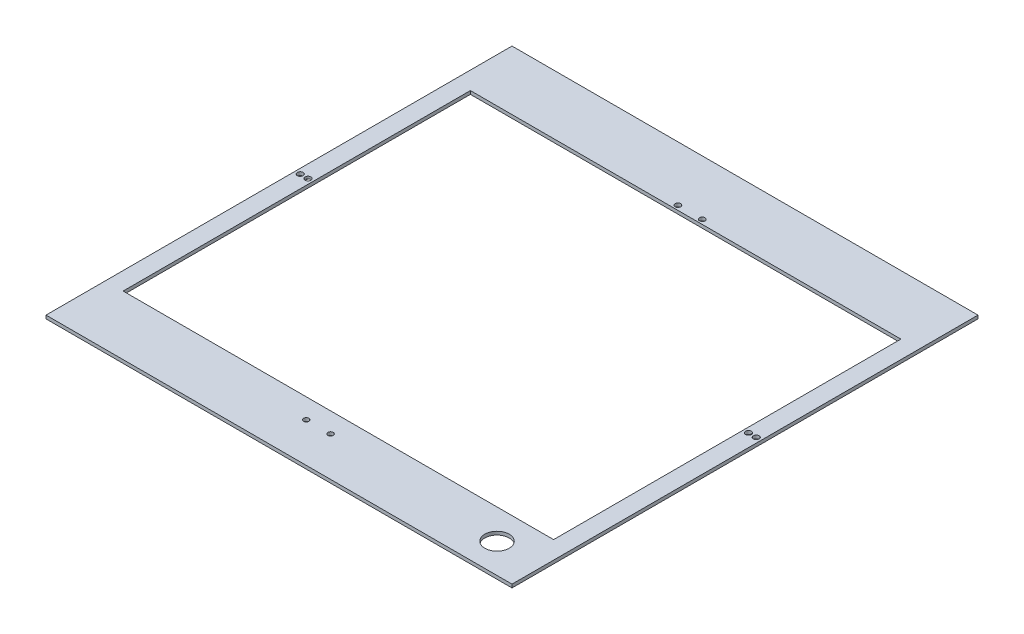
ISO-10303-21;
HEADER;
FILE_DESCRIPTION(('STEP AP214'),'2;1');
FILE_NAME('part.step','',(''),(''),'','','');
FILE_SCHEMA(('AUTOMOTIVE_DESIGN { 1 0 10303 214 1 1 1 1 }'));
ENDSEC;
DATA;
#1=APPLICATION_CONTEXT('core data for automotive mechanical design processes');
#2=APPLICATION_PROTOCOL_DEFINITION('international standard','automotive_design',2000,#1);
#3=PRODUCT_CONTEXT('',#1,'mechanical');
#4=PRODUCT('Part','Part','',(#3));
#5=PRODUCT_RELATED_PRODUCT_CATEGORY('part','',(#4));
#6=PRODUCT_DEFINITION_FORMATION('','',#4);
#7=PRODUCT_DEFINITION_CONTEXT('part definition',#1,'design');
#8=PRODUCT_DEFINITION('design','',#6,#7);
#9=PRODUCT_DEFINITION_SHAPE('','',#8);
#10=(LENGTH_UNIT() NAMED_UNIT(*) SI_UNIT(.MILLI.,.METRE.));
#11=(NAMED_UNIT(*) PLANE_ANGLE_UNIT() SI_UNIT($,.RADIAN.));
#12=(NAMED_UNIT(*) SI_UNIT($,.STERADIAN.) SOLID_ANGLE_UNIT());
#13=UNCERTAINTY_MEASURE_WITH_UNIT(LENGTH_MEASURE(1.E-05),#10,'distance_accuracy_value','');
#14=(GEOMETRIC_REPRESENTATION_CONTEXT(3) GLOBAL_UNCERTAINTY_ASSIGNED_CONTEXT((#13)) GLOBAL_UNIT_ASSIGNED_CONTEXT((#10,
#11,#12)) REPRESENTATION_CONTEXT('',''));
#15=CARTESIAN_POINT('',(0.,0.,0.));
#16=DIRECTION('',(0.,0.,1.));
#17=DIRECTION('',(1.,0.,0.));
#18=AXIS2_PLACEMENT_3D('',#15,#16,#17);
#19=CARTESIAN_POINT('',(0.,0.,0.));
#20=DIRECTION('',(0.,-1.,0.));
#21=DIRECTION('',(0.,0.,-1.));
#22=AXIS2_PLACEMENT_3D('',#19,#20,#21);
#23=PLANE('',#22);
#24=CARTESIAN_POINT('',(-205.5,0.,-14.63));
#25=DIRECTION('',(0.,1.,0.));
#26=DIRECTION('',(0.,0.,1.));
#27=AXIS2_PLACEMENT_3D('',#24,#25,#26);
#28=CIRCLE('',#27,2.59999999999999);
#29=CARTESIAN_POINT('',(-205.5,0.,-12.03));
#30=VERTEX_POINT('',#29);
#31=EDGE_CURVE('E356',#30,#30,#28,.T.);
#32=ORIENTED_EDGE('',*,*,#31,.T.);
#33=EDGE_LOOP('',(#32));
#34=FACE_BOUND('',#33,.T.);
#35=DIRECTION('',(0.,0.,1.));
#36=VECTOR('',#35,1.);
#37=CARTESIAN_POINT('',(-201.25,0.,0.));
#38=LINE('',#37,#36);
#39=CARTESIAN_POINT('',(-201.25,0.,-166.25));
#40=VERTEX_POINT('',#39);
#41=CARTESIAN_POINT('',(-201.25,0.,166.25));
#42=VERTEX_POINT('',#41);
#43=EDGE_CURVE('E313',#40,#42,#38,.T.);
#44=ORIENTED_EDGE('',*,*,#43,.T.);
#45=DIRECTION('',(1.,0.,0.));
#46=VECTOR('',#45,1.);
#47=CARTESIAN_POINT('',(0.,0.,166.25));
#48=LINE('',#47,#46);
#49=CARTESIAN_POINT('',(201.25,0.,166.25));
#50=VERTEX_POINT('',#49);
#51=EDGE_CURVE('E310',#42,#50,#48,.T.);
#52=ORIENTED_EDGE('',*,*,#51,.T.);
#53=DIRECTION('',(0.,0.,-1.));
#54=VECTOR('',#53,1.);
#55=CARTESIAN_POINT('',(201.25,0.,0.));
#56=LINE('',#55,#54);
#57=CARTESIAN_POINT('',(201.25,0.,-166.25));
#58=VERTEX_POINT('',#57);
#59=EDGE_CURVE('E320',#50,#58,#56,.T.);
#60=ORIENTED_EDGE('',*,*,#59,.T.);
#61=DIRECTION('',(-1.,0.,0.));
#62=VECTOR('',#61,1.);
#63=CARTESIAN_POINT('',(0.,0.,-166.25));
#64=LINE('',#63,#62);
#65=EDGE_CURVE('E317',#58,#40,#64,.T.);
#66=ORIENTED_EDGE('',*,*,#65,.T.);
#67=EDGE_LOOP('',(#44,#52,#60,#66));
#68=FACE_BOUND('',#67,.T.);
#69=CARTESIAN_POINT('',(169.75,0.,183.25));
#70=DIRECTION('',(0.,1.,0.));
#71=DIRECTION('',(0.,0.,1.));
#72=AXIS2_PLACEMENT_3D('',#69,#70,#71);
#73=CIRCLE('',#72,10.9999999999999);
#74=CARTESIAN_POINT('',(169.75,0.,194.25));
#75=VERTEX_POINT('',#74);
#76=EDGE_CURVE('E208',#75,#75,#73,.T.);
#77=ORIENTED_EDGE('',*,*,#76,.T.);
#78=EDGE_LOOP('',(#77));
#79=FACE_BOUND('',#78,.T.);
#80=DIRECTION('',(0.,0.,-1.));
#81=VECTOR('',#80,1.);
#82=CARTESIAN_POINT('',(210.,0.,210.));
#83=LINE('',#82,#81);
#84=CARTESIAN_POINT('',(210.,0.,210.));
#85=VERTEX_POINT('',#84);
#86=CARTESIAN_POINT('',(210.,0.,-210.));
#87=VERTEX_POINT('',#86);
#88=EDGE_CURVE('E263',#85,#87,#83,.T.);
#89=ORIENTED_EDGE('',*,*,#88,.F.);
#90=DIRECTION('',(1.,0.,0.));
#91=VECTOR('',#90,1.);
#92=CARTESIAN_POINT('',(-210.,0.,210.));
#93=LINE('',#92,#91);
#94=CARTESIAN_POINT('',(-210.,0.,210.));
#95=VERTEX_POINT('',#94);
#96=EDGE_CURVE('E268',#95,#85,#93,.T.);
#97=ORIENTED_EDGE('',*,*,#96,.F.);
#98=DIRECTION('',(0.,0.,1.));
#99=VECTOR('',#98,1.);
#100=CARTESIAN_POINT('',(-210.,0.,210.));
#101=LINE('',#100,#99);
#102=CARTESIAN_POINT('',(-210.,0.,-210.));
#103=VERTEX_POINT('',#102);
#104=EDGE_CURVE('E279',#103,#95,#101,.T.);
#105=ORIENTED_EDGE('',*,*,#104,.F.);
#106=DIRECTION('',(-1.,0.,0.));
#107=VECTOR('',#106,1.);
#108=CARTESIAN_POINT('',(-210.,0.,-210.));
#109=LINE('',#108,#107);
#110=EDGE_CURVE('E277',#87,#103,#109,.T.);
#111=ORIENTED_EDGE('',*,*,#110,.F.);
#112=EDGE_LOOP('',(#89,#97,#105,#111));
#113=FACE_BOUND('',#112,.T.);
#114=CARTESIAN_POINT('',(11.,0.,174.5));
#115=DIRECTION('',(0.,1.,0.));
#116=DIRECTION('',(0.,0.,1.));
#117=AXIS2_PLACEMENT_3D('',#114,#115,#116);
#118=CIRCLE('',#117,2.40000000000002);
#119=CARTESIAN_POINT('',(11.,0.,176.9));
#120=VERTEX_POINT('',#119);
#121=EDGE_CURVE('E385',#120,#120,#118,.T.);
#122=ORIENTED_EDGE('',*,*,#121,.T.);
#123=EDGE_LOOP('',(#122));
#124=FACE_BOUND('',#123,.T.);
#125=CARTESIAN_POINT('',(-11.,0.,174.5));
#126=DIRECTION('',(0.,1.,0.));
#127=DIRECTION('',(0.,0.,1.));
#128=AXIS2_PLACEMENT_3D('',#125,#126,#127);
#129=CIRCLE('',#128,2.40000000000001);
#130=CARTESIAN_POINT('',(-11.,0.,176.9));
#131=VERTEX_POINT('',#130);
#132=EDGE_CURVE('E369',#131,#131,#129,.T.);
#133=ORIENTED_EDGE('',*,*,#132,.T.);
#134=EDGE_LOOP('',(#133));
#135=FACE_BOUND('',#134,.T.);
#136=CARTESIAN_POINT('',(205.5,0.,-14.6299999999998));
#137=DIRECTION('',(0.,1.,0.));
#138=DIRECTION('',(0.,0.,1.));
#139=AXIS2_PLACEMENT_3D('',#136,#137,#138);
#140=CIRCLE('',#139,2.59999999999999);
#141=CARTESIAN_POINT('',(205.5,0.,-12.0299999999998));
#142=VERTEX_POINT('',#141);
#143=EDGE_CURVE('E351',#142,#142,#140,.F.);
#144=ORIENTED_EDGE('',*,*,#143,.F.);
#145=EDGE_LOOP('',(#144));
#146=FACE_BOUND('',#145,.T.);
#147=ADVANCED_FACE('F39',(#34,#68,#79,#113,#124,#135,#146),#23,.T.);
#148=CARTESIAN_POINT('',(0.,3.,0.));
#149=DIRECTION('',(0.,-1.,0.));
#150=DIRECTION('',(0.,0.,-1.));
#151=AXIS2_PLACEMENT_3D('',#148,#149,#150);
#152=PLANE('',#151);
#153=CARTESIAN_POINT('',(-198.5,3.,-14.63));
#154=DIRECTION('',(0.,1.,0.));
#155=DIRECTION('',(0.,0.,1.));
#156=AXIS2_PLACEMENT_3D('',#153,#154,#155);
#157=CIRCLE('',#156,2.59999999999999);
#158=CARTESIAN_POINT('',(-198.5,3.,-12.03));
#159=VERTEX_POINT('',#158);
#160=EDGE_CURVE('E372',#159,#159,#157,.T.);
#161=ORIENTED_EDGE('',*,*,#160,.F.);
#162=EDGE_LOOP('',(#161));
#163=FACE_BOUND('',#162,.T.);
#164=CARTESIAN_POINT('',(-11.,3.,174.5));
#165=DIRECTION('',(0.,1.,0.));
#166=DIRECTION('',(0.,0.,1.));
#167=AXIS2_PLACEMENT_3D('',#164,#165,#166);
#168=CIRCLE('',#167,2.40000000000001);
#169=CARTESIAN_POINT('',(-11.,3.,176.9));
#170=VERTEX_POINT('',#169);
#171=EDGE_CURVE('E388',#170,#170,#168,.T.);
#172=ORIENTED_EDGE('',*,*,#171,.F.);
#173=EDGE_LOOP('',(#172));
#174=FACE_BOUND('',#173,.T.);
#175=CARTESIAN_POINT('',(11.,3.,-160.5));
#176=DIRECTION('',(0.,1.,0.));
#177=DIRECTION('',(0.,0.,1.));
#178=AXIS2_PLACEMENT_3D('',#175,#176,#177);
#179=CIRCLE('',#178,2.5);
#180=CARTESIAN_POINT('',(11.,3.,-158.));
#181=VERTEX_POINT('',#180);
#182=EDGE_CURVE('E376',#181,#181,#179,.T.);
#183=ORIENTED_EDGE('',*,*,#182,.F.);
#184=EDGE_LOOP('',(#183));
#185=FACE_BOUND('',#184,.T.);
#186=CARTESIAN_POINT('',(198.5,3.,-14.6299999999998));
#187=DIRECTION('',(0.,1.,0.));
#188=DIRECTION('',(0.,0.,1.));
#189=AXIS2_PLACEMENT_3D('',#186,#187,#188);
#190=CIRCLE('',#189,2.59999999999999);
#191=CARTESIAN_POINT('',(198.5,3.,-12.0299999999998));
#192=VERTEX_POINT('',#191);
#193=EDGE_CURVE('E192',#192,#192,#190,.F.);
#194=ORIENTED_EDGE('',*,*,#193,.T.);
#195=EDGE_LOOP('',(#194));
#196=FACE_BOUND('',#195,.T.);
#197=DIRECTION('',(0.,0.,-1.));
#198=VECTOR('',#197,1.);
#199=CARTESIAN_POINT('',(210.,3.,210.));
#200=LINE('',#199,#198);
#201=CARTESIAN_POINT('',(210.,3.,210.));
#202=VERTEX_POINT('',#201);
#203=CARTESIAN_POINT('',(210.,3.,-210.));
#204=VERTEX_POINT('',#203);
#205=EDGE_CURVE('E264',#202,#204,#200,.T.);
#206=ORIENTED_EDGE('',*,*,#205,.T.);
#207=DIRECTION('',(-1.,0.,0.));
#208=VECTOR('',#207,1.);
#209=CARTESIAN_POINT('',(-210.,3.,-210.));
#210=LINE('',#209,#208);
#211=CARTESIAN_POINT('',(-210.,3.,-210.));
#212=VERTEX_POINT('',#211);
#213=EDGE_CURVE('E267',#204,#212,#210,.T.);
#214=ORIENTED_EDGE('',*,*,#213,.T.);
#215=DIRECTION('',(0.,0.,1.));
#216=VECTOR('',#215,1.);
#217=CARTESIAN_POINT('',(-210.,3.,210.));
#218=LINE('',#217,#216);
#219=CARTESIAN_POINT('',(-210.,3.,210.));
#220=VERTEX_POINT('',#219);
#221=EDGE_CURVE('E270',#212,#220,#218,.T.);
#222=ORIENTED_EDGE('',*,*,#221,.T.);
#223=DIRECTION('',(1.,0.,0.));
#224=VECTOR('',#223,1.);
#225=CARTESIAN_POINT('',(-210.,3.,210.));
#226=LINE('',#225,#224);
#227=EDGE_CURVE('E272',#220,#202,#226,.T.);
#228=ORIENTED_EDGE('',*,*,#227,.T.);
#229=EDGE_LOOP('',(#206,#214,#222,#228));
#230=FACE_BOUND('',#229,.T.);
#231=DIRECTION('',(0.,0.,-1.));
#232=VECTOR('',#231,1.);
#233=CARTESIAN_POINT('',(194.,3.,-156.5));
#234=LINE('',#233,#232);
#235=CARTESIAN_POINT('',(194.,3.,156.5));
#236=VERTEX_POINT('',#235);
#237=CARTESIAN_POINT('',(194.,3.,-156.5));
#238=VERTEX_POINT('',#237);
#239=EDGE_CURVE('E233',#236,#238,#234,.T.);
#240=ORIENTED_EDGE('',*,*,#239,.F.);
#241=DIRECTION('',(1.,0.,0.));
#242=VECTOR('',#241,1.);
#243=CARTESIAN_POINT('',(-194.,3.,156.5));
#244=LINE('',#243,#242);
#245=CARTESIAN_POINT('',(-194.,3.,156.5));
#246=VERTEX_POINT('',#245);
#247=EDGE_CURVE('E241',#246,#236,#244,.T.);
#248=ORIENTED_EDGE('',*,*,#247,.F.);
#249=DIRECTION('',(0.,0.,1.));
#250=VECTOR('',#249,1.);
#251=CARTESIAN_POINT('',(-194.,3.,-156.5));
#252=LINE('',#251,#250);
#253=CARTESIAN_POINT('',(-194.,3.,-156.5));
#254=VERTEX_POINT('',#253);
#255=EDGE_CURVE('E238',#254,#246,#252,.T.);
#256=ORIENTED_EDGE('',*,*,#255,.F.);
#257=DIRECTION('',(-1.,0.,0.));
#258=VECTOR('',#257,1.);
#259=CARTESIAN_POINT('',(-194.,3.,-156.5));
#260=LINE('',#259,#258);
#261=EDGE_CURVE('E235',#238,#254,#260,.T.);
#262=ORIENTED_EDGE('',*,*,#261,.F.);
#263=EDGE_LOOP('',(#240,#248,#256,#262));
#264=FACE_BOUND('',#263,.T.);
#265=CARTESIAN_POINT('',(169.75,3.,183.25));
#266=DIRECTION('',(0.,1.,0.));
#267=DIRECTION('',(0.,0.,1.));
#268=AXIS2_PLACEMENT_3D('',#265,#266,#267);
#269=CIRCLE('',#268,10.9999999999999);
#270=CARTESIAN_POINT('',(169.75,3.,194.25));
#271=VERTEX_POINT('',#270);
#272=EDGE_CURVE('E227',#271,#271,#269,.T.);
#273=ORIENTED_EDGE('',*,*,#272,.F.);
#274=EDGE_LOOP('',(#273));
#275=FACE_BOUND('',#274,.T.);
#276=CARTESIAN_POINT('',(11.,3.,174.5));
#277=DIRECTION('',(0.,1.,0.));
#278=DIRECTION('',(0.,0.,1.));
#279=AXIS2_PLACEMENT_3D('',#276,#277,#278);
#280=CIRCLE('',#279,2.40000000000002);
#281=CARTESIAN_POINT('',(11.,3.,176.9));
#282=VERTEX_POINT('',#281);
#283=EDGE_CURVE('E382',#282,#282,#280,.T.);
#284=ORIENTED_EDGE('',*,*,#283,.F.);
#285=EDGE_LOOP('',(#284));
#286=FACE_BOUND('',#285,.T.);
#287=CARTESIAN_POINT('',(205.5,3.,-14.6299999999998));
#288=DIRECTION('',(0.,1.,0.));
#289=DIRECTION('',(0.,0.,1.));
#290=AXIS2_PLACEMENT_3D('',#287,#288,#289);
#291=CIRCLE('',#290,2.59999999999999);
#292=CARTESIAN_POINT('',(205.5,3.,-12.0299999999998));
#293=VERTEX_POINT('',#292);
#294=EDGE_CURVE('E360',#293,#293,#291,.F.);
#295=ORIENTED_EDGE('',*,*,#294,.T.);
#296=EDGE_LOOP('',(#295));
#297=FACE_BOUND('',#296,.T.);
#298=CARTESIAN_POINT('',(-205.5,3.,-14.63));
#299=DIRECTION('',(0.,1.,0.));
#300=DIRECTION('',(0.,0.,1.));
#301=AXIS2_PLACEMENT_3D('',#298,#299,#300);
#302=CIRCLE('',#301,2.59999999999999);
#303=CARTESIAN_POINT('',(-205.5,3.,-12.03));
#304=VERTEX_POINT('',#303);
#305=EDGE_CURVE('E353',#304,#304,#302,.T.);
#306=ORIENTED_EDGE('',*,*,#305,.F.);
#307=EDGE_LOOP('',(#306));
#308=FACE_BOUND('',#307,.T.);
#309=CARTESIAN_POINT('',(-11.,3.,-160.5));
#310=DIRECTION('',(0.,1.,0.));
#311=DIRECTION('',(0.,0.,1.));
#312=AXIS2_PLACEMENT_3D('',#309,#310,#311);
#313=CIRCLE('',#312,2.5);
#314=CARTESIAN_POINT('',(-11.,3.,-158.));
#315=VERTEX_POINT('',#314);
#316=EDGE_CURVE('E365',#315,#315,#313,.T.);
#317=ORIENTED_EDGE('',*,*,#316,.F.);
#318=EDGE_LOOP('',(#317));
#319=FACE_BOUND('',#318,.T.);
#320=ADVANCED_FACE('F404',(#163,#174,#185,#196,#230,#264,#275,#286,#297,#308,#319),#152,.F.);
#321=CARTESIAN_POINT('',(11.,0.,-160.5));
#322=DIRECTION('',(0.,1.,0.));
#323=DIRECTION('',(0.,0.,1.));
#324=AXIS2_PLACEMENT_3D('',#321,#322,#323);
#325=CIRCLE('',#324,2.5);
#326=CARTESIAN_POINT('',(11.,0.,-158.));
#327=VERTEX_POINT('',#326);
#328=EDGE_CURVE('E379',#327,#327,#325,.T.);
#329=ORIENTED_EDGE('',*,*,#328,.T.);
#330=EDGE_LOOP('',(#329));
#331=FACE_BOUND('',#330,.T.);
#332=DIRECTION('',(1.,0.,0.));
#333=VECTOR('',#332,1.);
#334=CARTESIAN_POINT('',(-194.,0.,156.5));
#335=LINE('',#334,#333);
#336=CARTESIAN_POINT('',(-194.,0.,156.5));
#337=VERTEX_POINT('',#336);
#338=CARTESIAN_POINT('',(194.,0.,156.5));
#339=VERTEX_POINT('',#338);
#340=EDGE_CURVE('E236',#337,#339,#335,.T.);
#341=ORIENTED_EDGE('',*,*,#340,.T.);
#342=DIRECTION('',(0.,0.,-1.));
#343=VECTOR('',#342,1.);
#344=CARTESIAN_POINT('',(194.,0.,-156.5));
#345=LINE('',#344,#343);
#346=CARTESIAN_POINT('',(194.,0.,-156.5));
#347=VERTEX_POINT('',#346);
#348=EDGE_CURVE('E230',#339,#347,#345,.T.);
#349=ORIENTED_EDGE('',*,*,#348,.T.);
#350=DIRECTION('',(-1.,0.,0.));
#351=VECTOR('',#350,1.);
#352=CARTESIAN_POINT('',(-194.,0.,-156.5));
#353=LINE('',#352,#351);
#354=CARTESIAN_POINT('',(-194.,0.,-156.5));
#355=VERTEX_POINT('',#354);
#356=EDGE_CURVE('E246',#347,#355,#353,.T.);
#357=ORIENTED_EDGE('',*,*,#356,.T.);
#358=DIRECTION('',(0.,0.,1.));
#359=VECTOR('',#358,1.);
#360=CARTESIAN_POINT('',(-194.,0.,-156.5));
#361=LINE('',#360,#359);
#362=EDGE_CURVE('E249',#355,#337,#361,.T.);
#363=ORIENTED_EDGE('',*,*,#362,.T.);
#364=EDGE_LOOP('',(#341,#349,#357,#363));
#365=FACE_BOUND('',#364,.T.);
#366=CARTESIAN_POINT('',(-198.5,0.,-14.63));
#367=DIRECTION('',(0.,1.,0.));
#368=DIRECTION('',(0.,0.,1.));
#369=AXIS2_PLACEMENT_3D('',#366,#367,#368);
#370=CIRCLE('',#369,2.59999999999999);
#371=CARTESIAN_POINT('',(-198.25,0.,-12.0420471410785));
#372=VERTEX_POINT('',#371);
#373=CARTESIAN_POINT('',(-198.25,0.,-17.2179528589215));
#374=VERTEX_POINT('',#373);
#375=EDGE_CURVE('E357',#372,#374,#370,.T.);
#376=ORIENTED_EDGE('',*,*,#375,.T.);
#377=DIRECTION('',(0.,0.,1.));
#378=VECTOR('',#377,1.);
#379=CARTESIAN_POINT('',(-198.25,0.,0.));
#380=LINE('',#379,#378);
#381=CARTESIAN_POINT('',(-198.25,0.,-163.25));
#382=VERTEX_POINT('',#381);
#383=EDGE_CURVE('E323',#382,#374,#380,.T.);
#384=ORIENTED_EDGE('',*,*,#383,.F.);
#385=DIRECTION('',(-1.,0.,0.));
#386=VECTOR('',#385,1.);
#387=CARTESIAN_POINT('',(0.,0.,-163.25));
#388=LINE('',#387,#386);
#389=CARTESIAN_POINT('',(198.25,0.,-163.25));
#390=VERTEX_POINT('',#389);
#391=EDGE_CURVE('E197',#390,#382,#388,.T.);
#392=ORIENTED_EDGE('',*,*,#391,.F.);
#393=DIRECTION('',(0.,0.,-1.));
#394=VECTOR('',#393,1.);
#395=CARTESIAN_POINT('',(198.25,0.,0.));
#396=LINE('',#395,#394);
#397=CARTESIAN_POINT('',(198.25,0.,-17.2179528589213));
#398=VERTEX_POINT('',#397);
#399=EDGE_CURVE('E191',#398,#390,#396,.T.);
#400=ORIENTED_EDGE('',*,*,#399,.F.);
#401=CARTESIAN_POINT('',(198.5,0.,-14.6299999999998));
#402=DIRECTION('',(0.,1.,0.));
#403=DIRECTION('',(0.,0.,1.));
#404=AXIS2_PLACEMENT_3D('',#401,#402,#403);
#405=CIRCLE('',#404,2.59999999999999);
#406=CARTESIAN_POINT('',(198.25,0.,-12.0420471410783));
#407=VERTEX_POINT('',#406);
#408=EDGE_CURVE('E176',#407,#398,#405,.F.);
#409=ORIENTED_EDGE('',*,*,#408,.F.);
#410=CARTESIAN_POINT('',(198.25,0.,163.25));
#411=VERTEX_POINT('',#410);
#412=EDGE_CURVE('E189',#411,#407,#396,.T.);
#413=ORIENTED_EDGE('',*,*,#412,.F.);
#414=DIRECTION('',(1.,0.,0.));
#415=VECTOR('',#414,1.);
#416=CARTESIAN_POINT('',(0.,0.,163.25));
#417=LINE('',#416,#415);
#418=CARTESIAN_POINT('',(-198.25,0.,163.25));
#419=VERTEX_POINT('',#418);
#420=EDGE_CURVE('E202',#419,#411,#417,.T.);
#421=ORIENTED_EDGE('',*,*,#420,.F.);
#422=EDGE_CURVE('E322',#372,#419,#380,.T.);
#423=ORIENTED_EDGE('',*,*,#422,.F.);
#424=EDGE_LOOP('',(#376,#384,#392,#400,#409,#413,#421,#423));
#425=FACE_BOUND('',#424,.T.);
#426=CARTESIAN_POINT('',(-11.,0.,-160.5));
#427=DIRECTION('',(0.,1.,0.));
#428=DIRECTION('',(0.,0.,1.));
#429=AXIS2_PLACEMENT_3D('',#426,#427,#428);
#430=CIRCLE('',#429,2.5);
#431=CARTESIAN_POINT('',(-11.,0.,-158.));
#432=VERTEX_POINT('',#431);
#433=EDGE_CURVE('E368',#432,#432,#430,.T.);
#434=ORIENTED_EDGE('',*,*,#433,.T.);
#435=EDGE_LOOP('',(#434));
#436=FACE_BOUND('',#435,.T.);
#437=ADVANCED_FACE('F186',(#331,#365,#425,#436),#23,.T.);
#438=CARTESIAN_POINT('',(-198.25,1.,0.));
#439=DIRECTION('',(1.,0.,0.));
#440=DIRECTION('',(0.,0.,-1.));
#441=AXIS2_PLACEMENT_3D('',#438,#439,#440);
#442=PLANE('',#441);
#443=ORIENTED_EDGE('',*,*,#383,.T.);
#444=DIRECTION('',(0.,1.,0.));
#445=VECTOR('',#444,1.);
#446=CARTESIAN_POINT('',(-198.25,0.,-17.2179528589215));
#447=LINE('',#446,#445);
#448=CARTESIAN_POINT('',(-198.25,1.,-17.2179528589215));
#449=VERTEX_POINT('',#448);
#450=EDGE_CURVE('E314',#374,#449,#447,.T.);
#451=ORIENTED_EDGE('',*,*,#450,.T.);
#452=DIRECTION('',(0.,0.,1.));
#453=VECTOR('',#452,1.);
#454=CARTESIAN_POINT('',(-198.25,1.,0.));
#455=LINE('',#454,#453);
#456=CARTESIAN_POINT('',(-198.25,1.,-163.25));
#457=VERTEX_POINT('',#456);
#458=EDGE_CURVE('E305',#457,#449,#455,.T.);
#459=ORIENTED_EDGE('',*,*,#458,.F.);
#460=DIRECTION('',(0.,-1.,0.));
#461=VECTOR('',#460,1.);
#462=CARTESIAN_POINT('',(-198.25,1.,-163.25));
#463=LINE('',#462,#461);
#464=EDGE_CURVE('E206',#457,#382,#463,.T.);
#465=ORIENTED_EDGE('',*,*,#464,.T.);
#466=EDGE_LOOP('',(#443,#451,#459,#465));
#467=FACE_BOUND('',#466,.T.);
#468=ADVANCED_FACE('F456',(#467),#442,.F.);
#469=CARTESIAN_POINT('',(198.25,1.,0.));
#470=DIRECTION('',(-1.,0.,0.));
#471=DIRECTION('',(0.,0.,1.));
#472=AXIS2_PLACEMENT_3D('',#469,#470,#471);
#473=PLANE('',#472);
#474=DIRECTION('',(0.,1.,0.));
#475=VECTOR('',#474,1.);
#476=CARTESIAN_POINT('',(198.25,0.,-12.0420471410783));
#477=LINE('',#476,#475);
#478=CARTESIAN_POINT('',(198.25,1.,-12.0420471410783));
#479=VERTEX_POINT('',#478);
#480=EDGE_CURVE('E173',#479,#407,#477,.F.);
#481=ORIENTED_EDGE('',*,*,#480,.F.);
#482=DIRECTION('',(0.,0.,-1.));
#483=VECTOR('',#482,1.);
#484=CARTESIAN_POINT('',(198.25,1.,0.));
#485=LINE('',#484,#483);
#486=CARTESIAN_POINT('',(198.25,1.,163.25));
#487=VERTEX_POINT('',#486);
#488=EDGE_CURVE('E299',#487,#479,#485,.T.);
#489=ORIENTED_EDGE('',*,*,#488,.F.);
#490=DIRECTION('',(0.,-1.,0.));
#491=VECTOR('',#490,1.);
#492=CARTESIAN_POINT('',(198.25,1.,163.25));
#493=LINE('',#492,#491);
#494=EDGE_CURVE('E195',#487,#411,#493,.T.);
#495=ORIENTED_EDGE('',*,*,#494,.T.);
#496=ORIENTED_EDGE('',*,*,#412,.T.);
#497=EDGE_LOOP('',(#481,#489,#495,#496));
#498=FACE_BOUND('',#497,.T.);
#499=ADVANCED_FACE('F194',(#498),#473,.F.);
#500=DIRECTION('',(0.,1.,0.));
#501=VECTOR('',#500,1.);
#502=CARTESIAN_POINT('',(198.25,0.,-17.2179528589213));
#503=LINE('',#502,#501);
#504=CARTESIAN_POINT('',(198.25,1.,-17.2179528589213));
#505=VERTEX_POINT('',#504);
#506=EDGE_CURVE('E54',#398,#505,#503,.T.);
#507=ORIENTED_EDGE('',*,*,#506,.F.);
#508=ORIENTED_EDGE('',*,*,#399,.T.);
#509=DIRECTION('',(0.,-1.,0.));
#510=VECTOR('',#509,1.);
#511=CARTESIAN_POINT('',(198.25,1.,-163.25));
#512=LINE('',#511,#510);
#513=CARTESIAN_POINT('',(198.25,1.,-163.25));
#514=VERTEX_POINT('',#513);
#515=EDGE_CURVE('E209',#514,#390,#512,.T.);
#516=ORIENTED_EDGE('',*,*,#515,.F.);
#517=EDGE_CURVE('E296',#505,#514,#485,.T.);
#518=ORIENTED_EDGE('',*,*,#517,.F.);
#519=EDGE_LOOP('',(#507,#508,#516,#518));
#520=FACE_BOUND('',#519,.T.);
#521=ADVANCED_FACE('F301',(#520),#473,.F.);
#522=CARTESIAN_POINT('',(0.,1.,0.));
#523=DIRECTION('',(0.,-1.,0.));
#524=DIRECTION('',(0.,0.,-1.));
#525=AXIS2_PLACEMENT_3D('',#522,#523,#524);
#526=PLANE('',#525);
#527=DIRECTION('',(1.,0.,0.));
#528=VECTOR('',#527,1.);
#529=CARTESIAN_POINT('',(0.,1.,166.25));
#530=LINE('',#529,#528);
#531=CARTESIAN_POINT('',(-201.25,1.,166.25));
#532=VERTEX_POINT('',#531);
#533=CARTESIAN_POINT('',(201.25,1.,166.25));
#534=VERTEX_POINT('',#533);
#535=EDGE_CURVE('E200',#532,#534,#530,.T.);
#536=ORIENTED_EDGE('',*,*,#535,.F.);
#537=DIRECTION('',(0.,0.,1.));
#538=VECTOR('',#537,1.);
#539=CARTESIAN_POINT('',(-201.25,1.,0.));
#540=LINE('',#539,#538);
#541=CARTESIAN_POINT('',(-201.25,1.,-166.25));
#542=VERTEX_POINT('',#541);
#543=EDGE_CURVE('E343',#542,#532,#540,.T.);
#544=ORIENTED_EDGE('',*,*,#543,.F.);
#545=DIRECTION('',(-1.,0.,0.));
#546=VECTOR('',#545,1.);
#547=CARTESIAN_POINT('',(0.,1.,-166.25));
#548=LINE('',#547,#546);
#549=CARTESIAN_POINT('',(201.25,1.,-166.25));
#550=VERTEX_POINT('',#549);
#551=EDGE_CURVE('E339',#550,#542,#548,.T.);
#552=ORIENTED_EDGE('',*,*,#551,.F.);
#553=DIRECTION('',(0.,0.,-1.));
#554=VECTOR('',#553,1.);
#555=CARTESIAN_POINT('',(201.25,1.,0.));
#556=LINE('',#555,#554);
#557=EDGE_CURVE('E338',#534,#550,#556,.T.);
#558=ORIENTED_EDGE('',*,*,#557,.F.);
#559=EDGE_LOOP('',(#536,#544,#552,#558));
#560=FACE_BOUND('',#559,.T.);
#561=CARTESIAN_POINT('',(-198.5,1.,-14.63));
#562=DIRECTION('',(0.,-1.,0.));
#563=DIRECTION('',(0.,0.,-1.));
#564=AXIS2_PLACEMENT_3D('',#561,#562,#563);
#565=CIRCLE('',#564,2.59999999999999);
#566=CARTESIAN_POINT('',(-198.25,1.,-12.0420471410785));
#567=VERTEX_POINT('',#566);
#568=EDGE_CURVE('E11',#567,#449,#565,.T.);
#569=ORIENTED_EDGE('',*,*,#568,.F.);
#570=CARTESIAN_POINT('',(-198.25,1.,163.25));
#571=VERTEX_POINT('',#570);
#572=EDGE_CURVE('E336',#567,#571,#455,.T.);
#573=ORIENTED_EDGE('',*,*,#572,.T.);
#574=DIRECTION('',(1.,0.,0.));
#575=VECTOR('',#574,1.);
#576=CARTESIAN_POINT('',(0.,1.,163.25));
#577=LINE('',#576,#575);
#578=EDGE_CURVE('E303',#571,#487,#577,.T.);
#579=ORIENTED_EDGE('',*,*,#578,.T.);
#580=ORIENTED_EDGE('',*,*,#488,.T.);
#581=CARTESIAN_POINT('',(198.5,1.,-14.6299999999998));
#582=DIRECTION('',(0.,-1.,0.));
#583=DIRECTION('',(0.,0.,-1.));
#584=AXIS2_PLACEMENT_3D('',#581,#582,#583);
#585=CIRCLE('',#584,2.59999999999999);
#586=EDGE_CURVE('E47',#479,#505,#585,.F.);
#587=ORIENTED_EDGE('',*,*,#586,.T.);
#588=ORIENTED_EDGE('',*,*,#517,.T.);
#589=DIRECTION('',(-1.,0.,0.));
#590=VECTOR('',#589,1.);
#591=CARTESIAN_POINT('',(0.,1.,-163.25));
#592=LINE('',#591,#590);
#593=EDGE_CURVE('E226',#514,#457,#592,.T.);
#594=ORIENTED_EDGE('',*,*,#593,.T.);
#595=ORIENTED_EDGE('',*,*,#458,.T.);
#596=EDGE_LOOP('',(#569,#573,#579,#580,#587,#588,#594,#595));
#597=FACE_BOUND('',#596,.T.);
#598=ADVANCED_FACE('F294',(#560,#597),#526,.T.);
#599=CARTESIAN_POINT('',(210.,3.,210.));
#600=DIRECTION('',(-1.,0.,0.));
#601=DIRECTION('',(0.,0.,1.));
#602=AXIS2_PLACEMENT_3D('',#599,#600,#601);
#603=PLANE('',#602);
#604=ORIENTED_EDGE('',*,*,#88,.T.);
#605=DIRECTION('',(0.,-1.,0.));
#606=VECTOR('',#605,1.);
#607=CARTESIAN_POINT('',(210.,3.,-210.));
#608=LINE('',#607,#606);
#609=EDGE_CURVE('E290',#204,#87,#608,.T.);
#610=ORIENTED_EDGE('',*,*,#609,.F.);
#611=ORIENTED_EDGE('',*,*,#205,.F.);
#612=DIRECTION('',(0.,-1.,0.));
#613=VECTOR('',#612,1.);
#614=CARTESIAN_POINT('',(210.,3.,210.));
#615=LINE('',#614,#613);
#616=EDGE_CURVE('E274',#202,#85,#615,.T.);
#617=ORIENTED_EDGE('',*,*,#616,.T.);
#618=EDGE_LOOP('',(#604,#610,#611,#617));
#619=FACE_BOUND('',#618,.T.);
#620=ADVANCED_FACE('F41',(#619),#603,.F.);
#621=CARTESIAN_POINT('',(-210.,3.,-210.));
#622=DIRECTION('',(0.,0.,1.));
#623=DIRECTION('',(1.,0.,0.));
#624=AXIS2_PLACEMENT_3D('',#621,#622,#623);
#625=PLANE('',#624);
#626=ORIENTED_EDGE('',*,*,#110,.T.);
#627=DIRECTION('',(0.,-1.,0.));
#628=VECTOR('',#627,1.);
#629=CARTESIAN_POINT('',(-210.,3.,-210.));
#630=LINE('',#629,#628);
#631=EDGE_CURVE('E287',#212,#103,#630,.T.);
#632=ORIENTED_EDGE('',*,*,#631,.F.);
#633=ORIENTED_EDGE('',*,*,#213,.F.);
#634=ORIENTED_EDGE('',*,*,#609,.T.);
#635=EDGE_LOOP('',(#626,#632,#633,#634));
#636=FACE_BOUND('',#635,.T.);
#637=ADVANCED_FACE('F499',(#636),#625,.F.);
#638=CARTESIAN_POINT('',(-210.,3.,210.));
#639=DIRECTION('',(1.,0.,0.));
#640=DIRECTION('',(0.,0.,-1.));
#641=AXIS2_PLACEMENT_3D('',#638,#639,#640);
#642=PLANE('',#641);
#643=ORIENTED_EDGE('',*,*,#104,.T.);
#644=DIRECTION('',(0.,-1.,0.));
#645=VECTOR('',#644,1.);
#646=CARTESIAN_POINT('',(-210.,3.,210.));
#647=LINE('',#646,#645);
#648=EDGE_CURVE('E284',#220,#95,#647,.T.);
#649=ORIENTED_EDGE('',*,*,#648,.F.);
#650=ORIENTED_EDGE('',*,*,#221,.F.);
#651=ORIENTED_EDGE('',*,*,#631,.T.);
#652=EDGE_LOOP('',(#643,#649,#650,#651));
#653=FACE_BOUND('',#652,.T.);
#654=ADVANCED_FACE('F494',(#653),#642,.F.);
#655=CARTESIAN_POINT('',(-210.,3.,210.));
#656=DIRECTION('',(0.,0.,-1.));
#657=DIRECTION('',(-1.,0.,0.));
#658=AXIS2_PLACEMENT_3D('',#655,#656,#657);
#659=PLANE('',#658);
#660=ORIENTED_EDGE('',*,*,#96,.T.);
#661=ORIENTED_EDGE('',*,*,#616,.F.);
#662=ORIENTED_EDGE('',*,*,#227,.F.);
#663=ORIENTED_EDGE('',*,*,#648,.T.);
#664=EDGE_LOOP('',(#660,#661,#662,#663));
#665=FACE_BOUND('',#664,.T.);
#666=ADVANCED_FACE('F490',(#665),#659,.F.);
#667=CARTESIAN_POINT('',(194.,3.,-156.5));
#668=DIRECTION('',(-1.,0.,0.));
#669=DIRECTION('',(0.,0.,1.));
#670=AXIS2_PLACEMENT_3D('',#667,#668,#669);
#671=PLANE('',#670);
#672=ORIENTED_EDGE('',*,*,#348,.F.);
#673=DIRECTION('',(0.,-1.,0.));
#674=VECTOR('',#673,1.);
#675=CARTESIAN_POINT('',(194.,3.,156.5));
#676=LINE('',#675,#674);
#677=EDGE_CURVE('E243',#236,#339,#676,.T.);
#678=ORIENTED_EDGE('',*,*,#677,.F.);
#679=ORIENTED_EDGE('',*,*,#239,.T.);
#680=DIRECTION('',(0.,-1.,0.));
#681=VECTOR('',#680,1.);
#682=CARTESIAN_POINT('',(194.,3.,-156.5));
#683=LINE('',#682,#681);
#684=EDGE_CURVE('E260',#238,#347,#683,.T.);
#685=ORIENTED_EDGE('',*,*,#684,.T.);
#686=EDGE_LOOP('',(#672,#678,#679,#685));
#687=FACE_BOUND('',#686,.T.);
#688=ADVANCED_FACE('F470',(#687),#671,.T.);
#689=CARTESIAN_POINT('',(-194.,3.,-156.5));
#690=DIRECTION('',(0.,0.,1.));
#691=DIRECTION('',(1.,0.,0.));
#692=AXIS2_PLACEMENT_3D('',#689,#690,#691);
#693=PLANE('',#692);
#694=ORIENTED_EDGE('',*,*,#356,.F.);
#695=ORIENTED_EDGE('',*,*,#684,.F.);
#696=ORIENTED_EDGE('',*,*,#261,.T.);
#697=DIRECTION('',(0.,-1.,0.));
#698=VECTOR('',#697,1.);
#699=CARTESIAN_POINT('',(-194.,3.,-156.5));
#700=LINE('',#699,#698);
#701=EDGE_CURVE('E258',#254,#355,#700,.T.);
#702=ORIENTED_EDGE('',*,*,#701,.T.);
#703=EDGE_LOOP('',(#694,#695,#696,#702));
#704=FACE_BOUND('',#703,.T.);
#705=ADVANCED_FACE('F473',(#704),#693,.T.);
#706=CARTESIAN_POINT('',(-194.,3.,-156.5));
#707=DIRECTION('',(1.,0.,0.));
#708=DIRECTION('',(0.,0.,-1.));
#709=AXIS2_PLACEMENT_3D('',#706,#707,#708);
#710=PLANE('',#709);
#711=ORIENTED_EDGE('',*,*,#362,.F.);
#712=ORIENTED_EDGE('',*,*,#701,.F.);
#713=ORIENTED_EDGE('',*,*,#255,.T.);
#714=DIRECTION('',(0.,-1.,0.));
#715=VECTOR('',#714,1.);
#716=CARTESIAN_POINT('',(-194.,3.,156.5));
#717=LINE('',#716,#715);
#718=EDGE_CURVE('E256',#246,#337,#717,.T.);
#719=ORIENTED_EDGE('',*,*,#718,.T.);
#720=EDGE_LOOP('',(#711,#712,#713,#719));
#721=FACE_BOUND('',#720,.T.);
#722=ADVANCED_FACE('F477',(#721),#710,.T.);
#723=CARTESIAN_POINT('',(-194.,3.,156.5));
#724=DIRECTION('',(0.,0.,-1.));
#725=DIRECTION('',(-1.,0.,0.));
#726=AXIS2_PLACEMENT_3D('',#723,#724,#725);
#727=PLANE('',#726);
#728=ORIENTED_EDGE('',*,*,#340,.F.);
#729=ORIENTED_EDGE('',*,*,#718,.F.);
#730=ORIENTED_EDGE('',*,*,#247,.T.);
#731=ORIENTED_EDGE('',*,*,#677,.T.);
#732=EDGE_LOOP('',(#728,#729,#730,#731));
#733=FACE_BOUND('',#732,.T.);
#734=ADVANCED_FACE('F467',(#733),#727,.T.);
#735=CARTESIAN_POINT('',(169.75,3.,183.25));
#736=DIRECTION('',(0.,-1.,0.));
#737=DIRECTION('',(0.,0.,-1.));
#738=AXIS2_PLACEMENT_3D('',#735,#736,#737);
#739=CYLINDRICAL_SURFACE('',#738,10.9999999999999);
#740=ORIENTED_EDGE('',*,*,#272,.T.);
#741=EDGE_LOOP('',(#740));
#742=FACE_BOUND('',#741,.T.);
#743=ORIENTED_EDGE('',*,*,#76,.F.);
#744=EDGE_LOOP('',(#743));
#745=FACE_BOUND('',#744,.T.);
#746=ADVANCED_FACE('F484',(#742,#745),#739,.F.);
#747=ORIENTED_EDGE('',*,*,#572,.F.);
#748=DIRECTION('',(0.,1.,0.));
#749=VECTOR('',#748,1.);
#750=CARTESIAN_POINT('',(-198.25,0.,-12.0420471410785));
#751=LINE('',#750,#749);
#752=EDGE_CURVE('E61',#567,#372,#751,.F.);
#753=ORIENTED_EDGE('',*,*,#752,.T.);
#754=ORIENTED_EDGE('',*,*,#422,.T.);
#755=DIRECTION('',(0.,-1.,0.));
#756=VECTOR('',#755,1.);
#757=CARTESIAN_POINT('',(-198.25,1.,163.25));
#758=LINE('',#757,#756);
#759=EDGE_CURVE('E213',#571,#419,#758,.T.);
#760=ORIENTED_EDGE('',*,*,#759,.F.);
#761=EDGE_LOOP('',(#747,#753,#754,#760));
#762=FACE_BOUND('',#761,.T.);
#763=ADVANCED_FACE('F332',(#762),#442,.F.);
#764=CARTESIAN_POINT('',(0.,1.,-163.25));
#765=DIRECTION('',(0.,0.,1.));
#766=DIRECTION('',(1.,0.,0.));
#767=AXIS2_PLACEMENT_3D('',#764,#765,#766);
#768=PLANE('',#767);
#769=ORIENTED_EDGE('',*,*,#391,.T.);
#770=ORIENTED_EDGE('',*,*,#464,.F.);
#771=ORIENTED_EDGE('',*,*,#593,.F.);
#772=ORIENTED_EDGE('',*,*,#515,.T.);
#773=EDGE_LOOP('',(#769,#770,#771,#772));
#774=FACE_BOUND('',#773,.T.);
#775=ADVANCED_FACE('F534',(#774),#768,.F.);
#776=CARTESIAN_POINT('',(0.,1.,166.25));
#777=DIRECTION('',(0.,0.,-1.));
#778=DIRECTION('',(-1.,0.,0.));
#779=AXIS2_PLACEMENT_3D('',#776,#777,#778);
#780=PLANE('',#779);
#781=ORIENTED_EDGE('',*,*,#51,.F.);
#782=DIRECTION('',(0.,-1.,0.));
#783=VECTOR('',#782,1.);
#784=CARTESIAN_POINT('',(-201.25,1.,166.25));
#785=LINE('',#784,#783);
#786=EDGE_CURVE('E223',#532,#42,#785,.T.);
#787=ORIENTED_EDGE('',*,*,#786,.F.);
#788=ORIENTED_EDGE('',*,*,#535,.T.);
#789=DIRECTION('',(0.,-1.,0.));
#790=VECTOR('',#789,1.);
#791=CARTESIAN_POINT('',(201.25,1.,166.25));
#792=LINE('',#791,#790);
#793=EDGE_CURVE('E216',#534,#50,#792,.T.);
#794=ORIENTED_EDGE('',*,*,#793,.T.);
#795=EDGE_LOOP('',(#781,#787,#788,#794));
#796=FACE_BOUND('',#795,.T.);
#797=ADVANCED_FACE('F536',(#796),#780,.T.);
#798=CARTESIAN_POINT('',(201.25,1.,0.));
#799=DIRECTION('',(-1.,0.,0.));
#800=DIRECTION('',(0.,0.,1.));
#801=AXIS2_PLACEMENT_3D('',#798,#799,#800);
#802=PLANE('',#801);
#803=ORIENTED_EDGE('',*,*,#59,.F.);
#804=ORIENTED_EDGE('',*,*,#793,.F.);
#805=ORIENTED_EDGE('',*,*,#557,.T.);
#806=DIRECTION('',(0.,-1.,0.));
#807=VECTOR('',#806,1.);
#808=CARTESIAN_POINT('',(201.25,1.,-166.25));
#809=LINE('',#808,#807);
#810=EDGE_CURVE('E219',#550,#58,#809,.T.);
#811=ORIENTED_EDGE('',*,*,#810,.T.);
#812=EDGE_LOOP('',(#803,#804,#805,#811));
#813=FACE_BOUND('',#812,.T.);
#814=ADVANCED_FACE('F542',(#813),#802,.T.);
#815=CARTESIAN_POINT('',(0.,1.,-166.25));
#816=DIRECTION('',(0.,0.,1.));
#817=DIRECTION('',(1.,0.,0.));
#818=AXIS2_PLACEMENT_3D('',#815,#816,#817);
#819=PLANE('',#818);
#820=ORIENTED_EDGE('',*,*,#65,.F.);
#821=ORIENTED_EDGE('',*,*,#810,.F.);
#822=ORIENTED_EDGE('',*,*,#551,.T.);
#823=DIRECTION('',(0.,-1.,0.));
#824=VECTOR('',#823,1.);
#825=CARTESIAN_POINT('',(-201.25,1.,-166.25));
#826=LINE('',#825,#824);
#827=EDGE_CURVE('E221',#542,#40,#826,.T.);
#828=ORIENTED_EDGE('',*,*,#827,.T.);
#829=EDGE_LOOP('',(#820,#821,#822,#828));
#830=FACE_BOUND('',#829,.T.);
#831=ADVANCED_FACE('F545',(#830),#819,.T.);
#832=CARTESIAN_POINT('',(-201.25,1.,0.));
#833=DIRECTION('',(1.,0.,0.));
#834=DIRECTION('',(0.,0.,-1.));
#835=AXIS2_PLACEMENT_3D('',#832,#833,#834);
#836=PLANE('',#835);
#837=ORIENTED_EDGE('',*,*,#43,.F.);
#838=ORIENTED_EDGE('',*,*,#827,.F.);
#839=ORIENTED_EDGE('',*,*,#543,.T.);
#840=ORIENTED_EDGE('',*,*,#786,.T.);
#841=EDGE_LOOP('',(#837,#838,#839,#840));
#842=FACE_BOUND('',#841,.T.);
#843=ADVANCED_FACE('F540',(#842),#836,.T.);
#844=CARTESIAN_POINT('',(0.,1.,163.25));
#845=DIRECTION('',(0.,0.,-1.));
#846=DIRECTION('',(-1.,0.,0.));
#847=AXIS2_PLACEMENT_3D('',#844,#845,#846);
#848=PLANE('',#847);
#849=ORIENTED_EDGE('',*,*,#420,.T.);
#850=ORIENTED_EDGE('',*,*,#494,.F.);
#851=ORIENTED_EDGE('',*,*,#578,.F.);
#852=ORIENTED_EDGE('',*,*,#759,.T.);
#853=EDGE_LOOP('',(#849,#850,#851,#852));
#854=FACE_BOUND('',#853,.T.);
#855=ADVANCED_FACE('F335',(#854),#848,.F.);
#856=CARTESIAN_POINT('',(198.5,0.,-14.6299999999998));
#857=DIRECTION('',(0.,1.,0.));
#858=DIRECTION('',(0.,0.,1.));
#859=AXIS2_PLACEMENT_3D('',#856,#857,#858);
#860=CYLINDRICAL_SURFACE('',#859,2.59999999999999);
#861=ORIENTED_EDGE('',*,*,#193,.F.);
#862=EDGE_LOOP('',(#861));
#863=FACE_BOUND('',#862,.T.);
#864=ORIENTED_EDGE('',*,*,#480,.T.);
#865=ORIENTED_EDGE('',*,*,#408,.T.);
#866=ORIENTED_EDGE('',*,*,#506,.T.);
#867=ORIENTED_EDGE('',*,*,#586,.F.);
#868=EDGE_LOOP('',(#864,#865,#866,#867));
#869=FACE_BOUND('',#868,.T.);
#870=ADVANCED_FACE('F175',(#863,#869),#860,.F.);
#871=CARTESIAN_POINT('',(-198.5,0.,-14.63));
#872=DIRECTION('',(0.,1.,0.));
#873=DIRECTION('',(0.,0.,1.));
#874=AXIS2_PLACEMENT_3D('',#871,#872,#873);
#875=CYLINDRICAL_SURFACE('',#874,2.59999999999999);
#876=ORIENTED_EDGE('',*,*,#160,.T.);
#877=EDGE_LOOP('',(#876));
#878=FACE_BOUND('',#877,.T.);
#879=ORIENTED_EDGE('',*,*,#375,.F.);
#880=ORIENTED_EDGE('',*,*,#752,.F.);
#881=ORIENTED_EDGE('',*,*,#568,.T.);
#882=ORIENTED_EDGE('',*,*,#450,.F.);
#883=EDGE_LOOP('',(#879,#880,#881,#882));
#884=FACE_BOUND('',#883,.T.);
#885=ADVANCED_FACE('F441',(#878,#884),#875,.F.);
#886=CARTESIAN_POINT('',(11.,0.,-160.5));
#887=DIRECTION('',(0.,1.,0.));
#888=DIRECTION('',(0.,0.,1.));
#889=AXIS2_PLACEMENT_3D('',#886,#887,#888);
#890=CYLINDRICAL_SURFACE('',#889,2.5);
#891=ORIENTED_EDGE('',*,*,#328,.F.);
#892=EDGE_LOOP('',(#891));
#893=FACE_BOUND('',#892,.T.);
#894=ORIENTED_EDGE('',*,*,#182,.T.);
#895=EDGE_LOOP('',(#894));
#896=FACE_BOUND('',#895,.T.);
#897=ADVANCED_FACE('F432',(#893,#896),#890,.F.);
#898=CARTESIAN_POINT('',(-11.,0.,-160.5));
#899=DIRECTION('',(0.,1.,0.));
#900=DIRECTION('',(0.,0.,1.));
#901=AXIS2_PLACEMENT_3D('',#898,#899,#900);
#902=CYLINDRICAL_SURFACE('',#901,2.5);
#903=ORIENTED_EDGE('',*,*,#433,.F.);
#904=EDGE_LOOP('',(#903));
#905=FACE_BOUND('',#904,.T.);
#906=ORIENTED_EDGE('',*,*,#316,.T.);
#907=EDGE_LOOP('',(#906));
#908=FACE_BOUND('',#907,.T.);
#909=ADVANCED_FACE('F430',(#905,#908),#902,.F.);
#910=CARTESIAN_POINT('',(11.,0.,174.5));
#911=DIRECTION('',(0.,1.,0.));
#912=DIRECTION('',(0.,0.,1.));
#913=AXIS2_PLACEMENT_3D('',#910,#911,#912);
#914=CYLINDRICAL_SURFACE('',#913,2.40000000000002);
#915=ORIENTED_EDGE('',*,*,#121,.F.);
#916=EDGE_LOOP('',(#915));
#917=FACE_BOUND('',#916,.T.);
#918=ORIENTED_EDGE('',*,*,#283,.T.);
#919=EDGE_LOOP('',(#918));
#920=FACE_BOUND('',#919,.T.);
#921=ADVANCED_FACE('F400',(#917,#920),#914,.F.);
#922=CARTESIAN_POINT('',(-11.,0.,174.5));
#923=DIRECTION('',(0.,1.,0.));
#924=DIRECTION('',(0.,0.,1.));
#925=AXIS2_PLACEMENT_3D('',#922,#923,#924);
#926=CYLINDRICAL_SURFACE('',#925,2.40000000000001);
#927=ORIENTED_EDGE('',*,*,#132,.F.);
#928=EDGE_LOOP('',(#927));
#929=FACE_BOUND('',#928,.T.);
#930=ORIENTED_EDGE('',*,*,#171,.T.);
#931=EDGE_LOOP('',(#930));
#932=FACE_BOUND('',#931,.T.);
#933=ADVANCED_FACE('F396',(#929,#932),#926,.F.);
#934=CARTESIAN_POINT('',(205.5,0.,-14.6299999999998));
#935=DIRECTION('',(0.,1.,0.));
#936=DIRECTION('',(0.,0.,1.));
#937=AXIS2_PLACEMENT_3D('',#934,#935,#936);
#938=CYLINDRICAL_SURFACE('',#937,2.59999999999999);
#939=ORIENTED_EDGE('',*,*,#143,.T.);
#940=EDGE_LOOP('',(#939));
#941=FACE_BOUND('',#940,.T.);
#942=ORIENTED_EDGE('',*,*,#294,.F.);
#943=EDGE_LOOP('',(#942));
#944=FACE_BOUND('',#943,.T.);
#945=ADVANCED_FACE('F399',(#941,#944),#938,.F.);
#946=CARTESIAN_POINT('',(-205.5,0.,-14.63));
#947=DIRECTION('',(0.,1.,0.));
#948=DIRECTION('',(0.,0.,1.));
#949=AXIS2_PLACEMENT_3D('',#946,#947,#948);
#950=CYLINDRICAL_SURFACE('',#949,2.59999999999999);
#951=ORIENTED_EDGE('',*,*,#31,.F.);
#952=EDGE_LOOP('',(#951));
#953=FACE_BOUND('',#952,.T.);
#954=ORIENTED_EDGE('',*,*,#305,.T.);
#955=EDGE_LOOP('',(#954));
#956=FACE_BOUND('',#955,.T.);
#957=ADVANCED_FACE('F679',(#953,#956),#950,.F.);
#958=CLOSED_SHELL('',(#147,#320,#437,#468,#499,#521,#598,#620,#637,#654,#666,#688,#705,#722,
#734,#746,#763,#775,#797,#814,#831,#843,#855,#870,#885,#897,#909,#921,#933,#945,#957));
#959=MANIFOLD_SOLID_BREP('B2',#958);
#960=ADVANCED_BREP_SHAPE_REPRESENTATION('',(#18,#959),#14);
#961=SHAPE_DEFINITION_REPRESENTATION(#9,#960);
ENDSEC;
END-ISO-10303-21;
